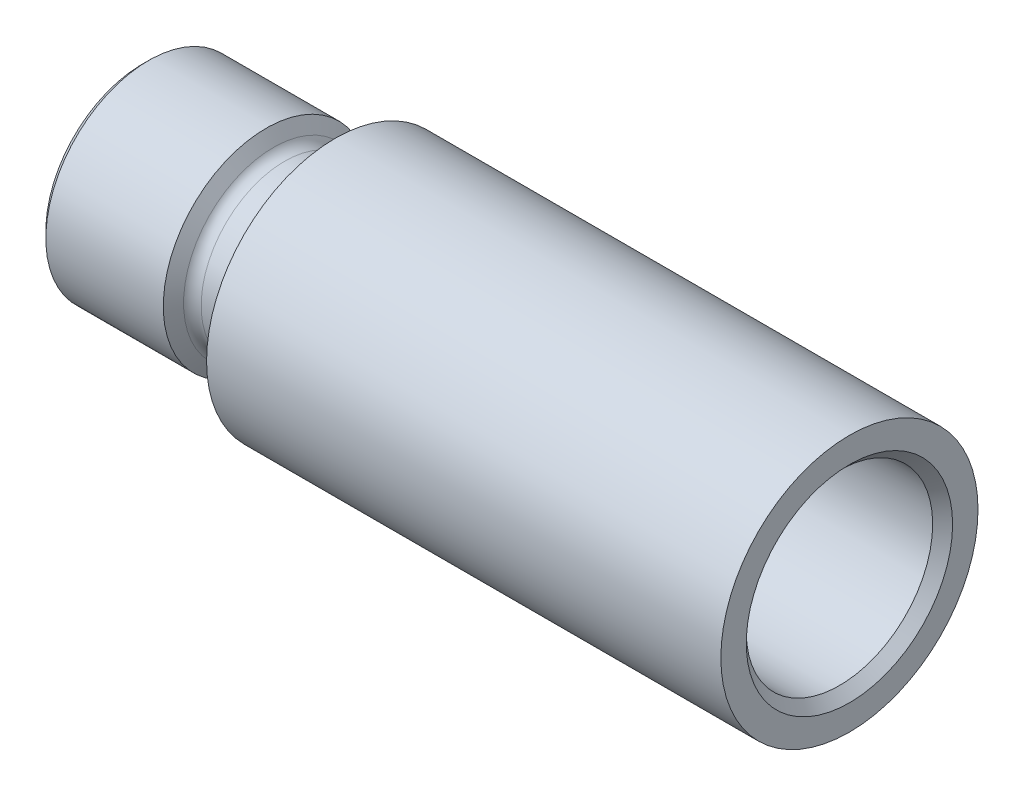
ISO-10303-21;
HEADER;
FILE_DESCRIPTION(('STEP AP214'),'2;1');
FILE_NAME('part.step','',(''),(''),'','','');
FILE_SCHEMA(('AUTOMOTIVE_DESIGN { 1 0 10303 214 1 1 1 1 }'));
ENDSEC;
DATA;
#1=APPLICATION_CONTEXT('core data for automotive mechanical design processes');
#2=APPLICATION_PROTOCOL_DEFINITION('international standard','automotive_design',2000,#1);
#3=PRODUCT_CONTEXT('',#1,'mechanical');
#4=PRODUCT('Part','Part','',(#3));
#5=PRODUCT_RELATED_PRODUCT_CATEGORY('part','',(#4));
#6=PRODUCT_DEFINITION_FORMATION('','',#4);
#7=PRODUCT_DEFINITION_CONTEXT('part definition',#1,'design');
#8=PRODUCT_DEFINITION('design','',#6,#7);
#9=PRODUCT_DEFINITION_SHAPE('','',#8);
#10=(LENGTH_UNIT() NAMED_UNIT(*) SI_UNIT(.MILLI.,.METRE.));
#11=(NAMED_UNIT(*) PLANE_ANGLE_UNIT() SI_UNIT($,.RADIAN.));
#12=(NAMED_UNIT(*) SI_UNIT($,.STERADIAN.) SOLID_ANGLE_UNIT());
#13=UNCERTAINTY_MEASURE_WITH_UNIT(LENGTH_MEASURE(1.E-05),#10,'distance_accuracy_value','');
#14=(GEOMETRIC_REPRESENTATION_CONTEXT(3) GLOBAL_UNCERTAINTY_ASSIGNED_CONTEXT((#13)) GLOBAL_UNIT_ASSIGNED_CONTEXT((#10,
#11,#12)) REPRESENTATION_CONTEXT('',''));
#15=CARTESIAN_POINT('',(0.,0.,0.));
#16=DIRECTION('',(0.,0.,1.));
#17=DIRECTION('',(1.,0.,0.));
#18=AXIS2_PLACEMENT_3D('',#15,#16,#17);
#19=CARTESIAN_POINT('',(55.,10.,0.));
#20=DIRECTION('',(-1.,0.,0.));
#21=DIRECTION('',(0.,0.,1.));
#22=AXIS2_PLACEMENT_3D('',#19,#20,#21);
#23=PLANE('',#22);
#24=CARTESIAN_POINT('',(55.,0.,0.));
#25=DIRECTION('',(1.,0.,0.));
#26=DIRECTION('',(0.,0.,-1.));
#27=AXIS2_PLACEMENT_3D('',#24,#25,#26);
#28=CIRCLE('',#27,8.025);
#29=CARTESIAN_POINT('',(55.,0.,-8.025));
#30=VERTEX_POINT('',#29);
#31=EDGE_CURVE('E69',#30,#30,#28,.T.);
#32=ORIENTED_EDGE('',*,*,#31,.F.);
#33=EDGE_LOOP('',(#32));
#34=FACE_BOUND('',#33,.T.);
#35=CARTESIAN_POINT('',(55.,0.,0.));
#36=DIRECTION('',(-1.,0.,0.));
#37=DIRECTION('',(0.,0.,1.));
#38=AXIS2_PLACEMENT_3D('',#35,#36,#37);
#39=CIRCLE('',#38,10.);
#40=CARTESIAN_POINT('',(55.,0.,10.));
#41=VERTEX_POINT('',#40);
#42=EDGE_CURVE('E57',#41,#41,#39,.T.);
#43=ORIENTED_EDGE('',*,*,#42,.F.);
#44=EDGE_LOOP('',(#43));
#45=FACE_BOUND('',#44,.T.);
#46=ADVANCED_FACE('F37',(#34,#45),#23,.F.);
#47=CARTESIAN_POINT('',(0.,0.,0.));
#48=DIRECTION('',(-1.,0.,0.));
#49=DIRECTION('',(0.,0.,1.));
#50=AXIS2_PLACEMENT_3D('',#47,#48,#49);
#51=CYLINDRICAL_SURFACE('',#50,4.);
#52=CARTESIAN_POINT('',(25.5472029881604,0.,0.));
#53=DIRECTION('',(1.,0.,0.));
#54=DIRECTION('',(0.,0.,-1.));
#55=AXIS2_PLACEMENT_3D('',#52,#53,#54);
#56=CIRCLE('',#55,4.);
#57=CARTESIAN_POINT('',(25.5472029881604,0.,-4.));
#58=VERTEX_POINT('',#57);
#59=EDGE_CURVE('E55',#58,#58,#56,.T.);
#60=ORIENTED_EDGE('',*,*,#59,.T.);
#61=EDGE_LOOP('',(#60));
#62=FACE_BOUND('',#61,.T.);
#63=CARTESIAN_POINT('',(0.,0.,0.));
#64=DIRECTION('',(-1.,0.,0.));
#65=DIRECTION('',(0.,0.,1.));
#66=AXIS2_PLACEMENT_3D('',#63,#64,#65);
#67=CIRCLE('',#66,3.99999999999999);
#68=CARTESIAN_POINT('',(0.,0.,3.99999999999999));
#69=VERTEX_POINT('',#68);
#70=EDGE_CURVE('E48',#69,#69,#67,.T.);
#71=ORIENTED_EDGE('',*,*,#70,.T.);
#72=EDGE_LOOP('',(#71));
#73=FACE_BOUND('',#72,.T.);
#74=ADVANCED_FACE('F125',(#62,#73),#51,.F.);
#75=CARTESIAN_POINT('',(0.,3.99999999999999,0.));
#76=DIRECTION('',(1.,0.,0.));
#77=DIRECTION('',(0.,0.,-1.));
#78=AXIS2_PLACEMENT_3D('',#75,#76,#77);
#79=PLANE('',#78);
#80=CARTESIAN_POINT('',(0.,0.,0.));
#81=DIRECTION('',(1.,0.,0.));
#82=DIRECTION('',(0.,0.,-1.));
#83=AXIS2_PLACEMENT_3D('',#80,#81,#82);
#84=CIRCLE('',#83,7.5);
#85=CARTESIAN_POINT('',(0.,0.,-7.5));
#86=VERTEX_POINT('',#85);
#87=EDGE_CURVE('E44',#86,#86,#84,.F.);
#88=ORIENTED_EDGE('',*,*,#87,.T.);
#89=EDGE_LOOP('',(#88));
#90=FACE_BOUND('',#89,.T.);
#91=ORIENTED_EDGE('',*,*,#70,.F.);
#92=EDGE_LOOP('',(#91));
#93=FACE_BOUND('',#92,.T.);
#94=ADVANCED_FACE('F116',(#90,#93),#79,.F.);
#95=CARTESIAN_POINT('',(0.,0.,0.));
#96=DIRECTION('',(-1.,0.,0.));
#97=DIRECTION('',(0.,0.,1.));
#98=AXIS2_PLACEMENT_3D('',#95,#96,#97);
#99=CYLINDRICAL_SURFACE('',#98,8.);
#100=CARTESIAN_POINT('',(9.63397459621557,0.,0.));
#101=DIRECTION('',(1.,0.,0.));
#102=DIRECTION('',(0.,0.,-1.));
#103=AXIS2_PLACEMENT_3D('',#100,#101,#102);
#104=CIRCLE('',#103,8.);
#105=CARTESIAN_POINT('',(9.63397459621557,0.,-8.));
#106=VERTEX_POINT('',#105);
#107=EDGE_CURVE('E72',#106,#106,#104,.T.);
#108=ORIENTED_EDGE('',*,*,#107,.F.);
#109=EDGE_LOOP('',(#108));
#110=FACE_BOUND('',#109,.T.);
#111=CARTESIAN_POINT('',(0.5,0.,0.));
#112=DIRECTION('',(1.,0.,0.));
#113=DIRECTION('',(0.,0.,-1.));
#114=AXIS2_PLACEMENT_3D('',#111,#112,#113);
#115=CIRCLE('',#114,8.);
#116=CARTESIAN_POINT('',(0.5,0.,-8.));
#117=VERTEX_POINT('',#116);
#118=EDGE_CURVE('E10',#117,#117,#115,.T.);
#119=ORIENTED_EDGE('',*,*,#118,.T.);
#120=EDGE_LOOP('',(#119));
#121=FACE_BOUND('',#120,.T.);
#122=ADVANCED_FACE('F114',(#110,#121),#99,.T.);
#123=CARTESIAN_POINT('',(15.,10.,0.));
#124=DIRECTION('',(1.,0.,0.));
#125=DIRECTION('',(0.,0.,-1.));
#126=AXIS2_PLACEMENT_3D('',#123,#124,#125);
#127=PLANE('',#126);
#128=CARTESIAN_POINT('',(15.,0.,0.));
#129=DIRECTION('',(-1.,0.,0.));
#130=DIRECTION('',(0.,0.,1.));
#131=AXIS2_PLACEMENT_3D('',#128,#129,#130);
#132=CIRCLE('',#131,10.);
#133=CARTESIAN_POINT('',(15.,0.,10.));
#134=VERTEX_POINT('',#133);
#135=EDGE_CURVE('E52',#134,#134,#132,.T.);
#136=ORIENTED_EDGE('',*,*,#135,.T.);
#137=EDGE_LOOP('',(#136));
#138=FACE_BOUND('',#137,.T.);
#139=CARTESIAN_POINT('',(15.,0.,0.));
#140=DIRECTION('',(1.,0.,0.));
#141=DIRECTION('',(0.,0.,-1.));
#142=AXIS2_PLACEMENT_3D('',#139,#140,#141);
#143=CIRCLE('',#142,7.5);
#144=CARTESIAN_POINT('',(15.,0.,-7.5));
#145=VERTEX_POINT('',#144);
#146=EDGE_CURVE('E84',#145,#145,#143,.T.);
#147=ORIENTED_EDGE('',*,*,#146,.T.);
#148=EDGE_LOOP('',(#147));
#149=FACE_BOUND('',#148,.T.);
#150=ADVANCED_FACE('F88',(#138,#149),#127,.F.);
#151=CARTESIAN_POINT('',(0.,0.,0.));
#152=DIRECTION('',(-1.,0.,0.));
#153=DIRECTION('',(0.,0.,1.));
#154=AXIS2_PLACEMENT_3D('',#151,#152,#153);
#155=CYLINDRICAL_SURFACE('',#154,10.);
#156=ORIENTED_EDGE('',*,*,#135,.F.);
#157=EDGE_LOOP('',(#156));
#158=FACE_BOUND('',#157,.T.);
#159=ORIENTED_EDGE('',*,*,#42,.T.);
#160=EDGE_LOOP('',(#159));
#161=FACE_BOUND('',#160,.T.);
#162=ADVANCED_FACE('F122',(#158,#161),#155,.T.);
#163=CARTESIAN_POINT('',(27.5,0.,0.));
#164=DIRECTION('',(1.,0.,0.));
#165=DIRECTION('',(0.,0.,-1.));
#166=AXIS2_PLACEMENT_3D('',#163,#164,#165);
#167=CONICAL_SURFACE('',#166,7.24999999999999,1.02974425867665);
#168=CARTESIAN_POINT('',(27.5,0.,0.));
#169=DIRECTION('',(1.,0.,0.));
#170=DIRECTION('',(0.,0.,-1.));
#171=AXIS2_PLACEMENT_3D('',#168,#169,#170);
#172=CIRCLE('',#171,7.24999999999999);
#173=CARTESIAN_POINT('',(27.5,0.,-7.24999999999999));
#174=VERTEX_POINT('',#173);
#175=EDGE_CURVE('E58',#174,#174,#172,.T.);
#176=ORIENTED_EDGE('',*,*,#175,.T.);
#177=EDGE_LOOP('',(#176));
#178=FACE_BOUND('',#177,.T.);
#179=ORIENTED_EDGE('',*,*,#59,.F.);
#180=EDGE_LOOP('',(#179));
#181=FACE_BOUND('',#180,.T.);
#182=ADVANCED_FACE('F139',(#178,#181),#167,.F.);
#183=CARTESIAN_POINT('',(55.,0.,0.));
#184=DIRECTION('',(1.,0.,0.));
#185=DIRECTION('',(0.,0.,-1.));
#186=AXIS2_PLACEMENT_3D('',#183,#184,#185);
#187=CYLINDRICAL_SURFACE('',#186,7.24999999999999);
#188=ORIENTED_EDGE('',*,*,#175,.F.);
#189=EDGE_LOOP('',(#188));
#190=FACE_BOUND('',#189,.T.);
#191=CARTESIAN_POINT('',(54.225,0.,0.));
#192=DIRECTION('',(1.,0.,0.));
#193=DIRECTION('',(0.,0.,-1.));
#194=AXIS2_PLACEMENT_3D('',#191,#192,#193);
#195=CIRCLE('',#194,7.25);
#196=CARTESIAN_POINT('',(54.225,0.,-7.25));
#197=VERTEX_POINT('',#196);
#198=EDGE_CURVE('E66',#197,#197,#195,.T.);
#199=ORIENTED_EDGE('',*,*,#198,.T.);
#200=EDGE_LOOP('',(#199));
#201=FACE_BOUND('',#200,.T.);
#202=ADVANCED_FACE('F145',(#190,#201),#187,.F.);
#203=CARTESIAN_POINT('',(55.,0.,0.));
#204=DIRECTION('',(1.,0.,0.));
#205=DIRECTION('',(0.,0.,-1.));
#206=AXIS2_PLACEMENT_3D('',#203,#204,#205);
#207=CONICAL_SURFACE('',#206,8.025,0.785398163397452);
#208=ORIENTED_EDGE('',*,*,#198,.F.);
#209=EDGE_LOOP('',(#208));
#210=FACE_BOUND('',#209,.T.);
#211=ORIENTED_EDGE('',*,*,#31,.T.);
#212=EDGE_LOOP('',(#211));
#213=FACE_BOUND('',#212,.T.);
#214=ADVANCED_FACE('F152',(#210,#213),#207,.F.);
#215=CARTESIAN_POINT('',(0.,0.,0.));
#216=DIRECTION('',(1.,0.,0.));
#217=DIRECTION('',(0.,0.,-1.));
#218=AXIS2_PLACEMENT_3D('',#215,#216,#217);
#219=CONICAL_SURFACE('',#218,7.5,0.785398163397448);
#220=ORIENTED_EDGE('',*,*,#118,.F.);
#221=EDGE_LOOP('',(#220));
#222=FACE_BOUND('',#221,.T.);
#223=ORIENTED_EDGE('',*,*,#87,.F.);
#224=EDGE_LOOP('',(#223));
#225=FACE_BOUND('',#224,.T.);
#226=ADVANCED_FACE('F39',(#222,#225),#219,.T.);
#227=CARTESIAN_POINT('',(9.63397459621557,0.,0.));
#228=DIRECTION('',(-1.,0.,0.));
#229=DIRECTION('',(0.,0.,1.));
#230=AXIS2_PLACEMENT_3D('',#227,#228,#229);
#231=CONICAL_SURFACE('',#230,8.,1.0471975511966);
#232=CARTESIAN_POINT('',(10.2113248654052,0.,0.));
#233=DIRECTION('',(1.,0.,0.));
#234=DIRECTION('',(0.,0.,-1.));
#235=AXIS2_PLACEMENT_3D('',#232,#233,#234);
#236=CIRCLE('',#235,7.);
#237=CARTESIAN_POINT('',(10.2113248654052,0.,-7.));
#238=VERTEX_POINT('',#237);
#239=EDGE_CURVE('E75',#238,#238,#236,.T.);
#240=ORIENTED_EDGE('',*,*,#239,.F.);
#241=EDGE_LOOP('',(#240));
#242=FACE_BOUND('',#241,.T.);
#243=ORIENTED_EDGE('',*,*,#107,.T.);
#244=EDGE_LOOP('',(#243));
#245=FACE_BOUND('',#244,.T.);
#246=ADVANCED_FACE('F105',(#242,#245),#231,.T.);
#247=CARTESIAN_POINT('',(11.0773502691896,0.,0.));
#248=DIRECTION('',(1.,0.,0.));
#249=DIRECTION('',(0.,0.,-1.));
#250=AXIS2_PLACEMENT_3D('',#247,#248,#249);
#251=TOROIDAL_SURFACE('',#250,7.5,0.999999999999997);
#252=CARTESIAN_POINT('',(11.0773502691896,0.,0.));
#253=DIRECTION('',(1.,0.,0.));
#254=DIRECTION('',(0.,0.,-1.));
#255=AXIS2_PLACEMENT_3D('',#252,#253,#254);
#256=CIRCLE('',#255,6.5);
#257=CARTESIAN_POINT('',(11.0773502691896,0.,-6.5));
#258=VERTEX_POINT('',#257);
#259=EDGE_CURVE('E78',#258,#258,#256,.T.);
#260=ORIENTED_EDGE('',*,*,#259,.F.);
#261=EDGE_LOOP('',(#260));
#262=FACE_BOUND('',#261,.T.);
#263=ORIENTED_EDGE('',*,*,#239,.T.);
#264=EDGE_LOOP('',(#263));
#265=FACE_BOUND('',#264,.T.);
#266=ADVANCED_FACE('F99',(#262,#265),#251,.F.);
#267=CARTESIAN_POINT('',(28.6771862029483,0.,0.));
#268=DIRECTION('',(1.,0.,0.));
#269=DIRECTION('',(0.,0.,-1.));
#270=AXIS2_PLACEMENT_3D('',#267,#268,#269);
#271=CYLINDRICAL_SURFACE('',#270,6.5);
#272=CARTESIAN_POINT('',(14.,0.,0.));
#273=DIRECTION('',(1.,0.,0.));
#274=DIRECTION('',(0.,0.,-1.));
#275=AXIS2_PLACEMENT_3D('',#272,#273,#274);
#276=CIRCLE('',#275,6.5);
#277=CARTESIAN_POINT('',(14.,0.,-6.5));
#278=VERTEX_POINT('',#277);
#279=EDGE_CURVE('E81',#278,#278,#276,.T.);
#280=ORIENTED_EDGE('',*,*,#279,.F.);
#281=EDGE_LOOP('',(#280));
#282=FACE_BOUND('',#281,.T.);
#283=ORIENTED_EDGE('',*,*,#259,.T.);
#284=EDGE_LOOP('',(#283));
#285=FACE_BOUND('',#284,.T.);
#286=ADVANCED_FACE('F93',(#282,#285),#271,.T.);
#287=CARTESIAN_POINT('',(14.,0.,0.));
#288=DIRECTION('',(1.,0.,0.));
#289=DIRECTION('',(0.,0.,-1.));
#290=AXIS2_PLACEMENT_3D('',#287,#288,#289);
#291=TOROIDAL_SURFACE('',#290,7.5,1.);
#292=ORIENTED_EDGE('',*,*,#146,.F.);
#293=EDGE_LOOP('',(#292));
#294=FACE_BOUND('',#293,.T.);
#295=ORIENTED_EDGE('',*,*,#279,.T.);
#296=EDGE_LOOP('',(#295));
#297=FACE_BOUND('',#296,.T.);
#298=ADVANCED_FACE('F90',(#294,#297),#291,.F.);
#299=CLOSED_SHELL('',(#46,#74,#94,#122,#150,#162,#182,#202,#214,#226,#246,#266,#286,#298));
#300=MANIFOLD_SOLID_BREP('B2',#299);
#301=ADVANCED_BREP_SHAPE_REPRESENTATION('',(#18,#300),#14);
#302=SHAPE_DEFINITION_REPRESENTATION(#9,#301);
ENDSEC;
END-ISO-10303-21;
